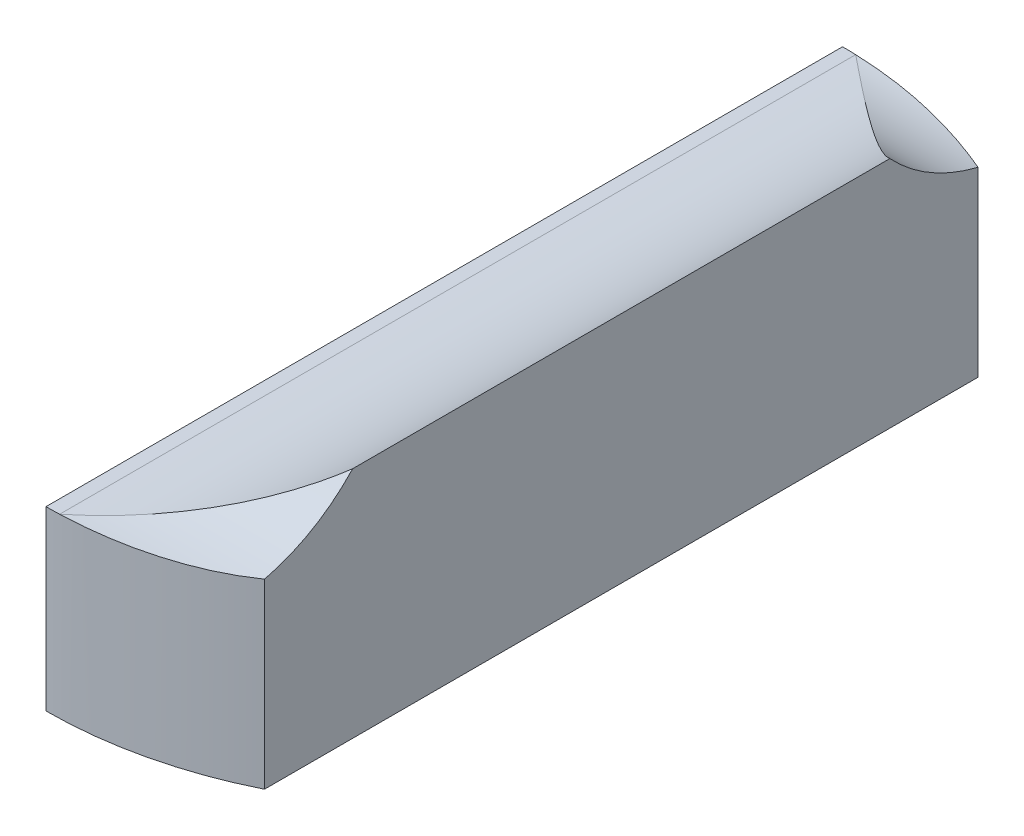
ISO-10303-21;
HEADER;
FILE_DESCRIPTION(('STEP AP214'),'2;1');
FILE_NAME('part.step','',(''),(''),'','','');
FILE_SCHEMA(('AUTOMOTIVE_DESIGN { 1 0 10303 214 1 1 1 1 }'));
ENDSEC;
DATA;
#1=APPLICATION_CONTEXT('core data for automotive mechanical design processes');
#2=APPLICATION_PROTOCOL_DEFINITION('international standard','automotive_design',2000,#1);
#3=PRODUCT_CONTEXT('',#1,'mechanical');
#4=PRODUCT('Part','Part','',(#3));
#5=PRODUCT_RELATED_PRODUCT_CATEGORY('part','',(#4));
#6=PRODUCT_DEFINITION_FORMATION('','',#4);
#7=PRODUCT_DEFINITION_CONTEXT('part definition',#1,'design');
#8=PRODUCT_DEFINITION('design','',#6,#7);
#9=PRODUCT_DEFINITION_SHAPE('','',#8);
#10=(LENGTH_UNIT() NAMED_UNIT(*) SI_UNIT(.MILLI.,.METRE.));
#11=(NAMED_UNIT(*) PLANE_ANGLE_UNIT() SI_UNIT($,.RADIAN.));
#12=(NAMED_UNIT(*) SI_UNIT($,.STERADIAN.) SOLID_ANGLE_UNIT());
#13=UNCERTAINTY_MEASURE_WITH_UNIT(LENGTH_MEASURE(1.E-05),#10,'distance_accuracy_value','');
#14=(GEOMETRIC_REPRESENTATION_CONTEXT(3) GLOBAL_UNCERTAINTY_ASSIGNED_CONTEXT((#13)) GLOBAL_UNIT_ASSIGNED_CONTEXT((#10,
#11,#12)) REPRESENTATION_CONTEXT('',''));
#15=CARTESIAN_POINT('',(0.,0.,0.));
#16=DIRECTION('',(0.,0.,1.));
#17=DIRECTION('',(1.,0.,0.));
#18=AXIS2_PLACEMENT_3D('',#15,#16,#17);
#19=CARTESIAN_POINT('',(0.,0.,0.));
#20=DIRECTION('',(0.,1.,0.));
#21=DIRECTION('',(1.,0.,0.));
#22=AXIS2_PLACEMENT_3D('',#19,#20,#21);
#23=CYLINDRICAL_SURFACE('',#22,28.575);
#24=DIRECTION('',(0.,1.,0.));
#25=VECTOR('',#24,1.);
#26=CARTESIAN_POINT('',(12.7,0.,-25.5976683508479));
#27=LINE('',#26,#25);
#28=CARTESIAN_POINT('',(12.7,0.,-25.5976683508479));
#29=VERTEX_POINT('',#28);
#30=CARTESIAN_POINT('',(12.7,13.0539279019213,-25.5976683508479));
#31=VERTEX_POINT('',#30);
#32=EDGE_CURVE('E346',#29,#31,#27,.T.);
#33=ORIENTED_EDGE('',*,*,#32,.F.);
#34=CARTESIAN_POINT('',(0.,0.,0.));
#35=DIRECTION('',(0.,1.,0.));
#36=DIRECTION('',(1.,0.,0.));
#37=AXIS2_PLACEMENT_3D('',#34,#35,#36);
#38=CIRCLE('',#37,28.575);
#39=CARTESIAN_POINT('',(0.,0.,-28.575));
#40=VERTEX_POINT('',#39);
#41=EDGE_CURVE('E332',#29,#40,#38,.T.);
#42=ORIENTED_EDGE('',*,*,#41,.T.);
#43=DIRECTION('',(0.,1.,0.));
#44=VECTOR('',#43,1.);
#45=CARTESIAN_POINT('',(0.,0.,-28.575));
#46=LINE('',#45,#44);
#47=CARTESIAN_POINT('',(0.,12.7,-28.575));
#48=VERTEX_POINT('',#47);
#49=EDGE_CURVE('E330',#48,#40,#46,.F.);
#50=ORIENTED_EDGE('',*,*,#49,.F.);
#51=CARTESIAN_POINT('',(0.,12.7,0.));
#52=DIRECTION('',(0.,1.,0.));
#53=DIRECTION('',(0.0333333333333333,0.,-0.999444290037663));
#54=AXIS2_PLACEMENT_3D('',#51,#52,#53);
#55=CIRCLE('',#54,28.575);
#56=CARTESIAN_POINT('',(0.962642841918007,12.7000054003817,-28.5587786987605));
#57=VERTEX_POINT('',#56);
#58=EDGE_CURVE('E163',#57,#48,#55,.T.);
#59=ORIENTED_EDGE('',*,*,#58,.F.);
#60=CARTESIAN_POINT('',(0.962642902416936,12.7000103571768,-28.5587804999168));
#61=CARTESIAN_POINT('',(1.36077615031565,12.7000623405133,-28.545365693838));
#62=CARTESIAN_POINT('',(1.75862825689667,12.7000777129765,-28.5236151588989));
#63=CARTESIAN_POINT('',(2.55307899624457,12.7004445435241,-28.4635033904875));
#64=CARTESIAN_POINT('',(2.94967761793325,12.7007960045706,-28.4251420106213));
#65=CARTESIAN_POINT('',(3.74118366922109,12.7022448100237,-28.3318388404815));
#66=CARTESIAN_POINT('',(4.13608981320989,12.7033426454376,-28.2768861487437));
#67=CARTESIAN_POINT('',(4.92324947448467,12.7069381444454,-28.1505085427578));
#68=CARTESIAN_POINT('',(5.31550300582789,12.7094358006152,-28.0790837158725));
#69=CARTESIAN_POINT('',(6.09971504117371,12.7166858056302,-27.9192672118512));
#70=CARTESIAN_POINT('',(6.49164726348036,12.7214556290705,-27.8307472529637));
#71=CARTESIAN_POINT('',(7.27137941731256,12.7342954372856,-27.6372759368325));
#72=CARTESIAN_POINT('',(7.65917937419231,12.7423654017998,-27.5323246804678));
#73=CARTESIAN_POINT('',(8.42975640726492,12.7630247664457,-27.3062442784199));
#74=CARTESIAN_POINT('',(8.812535403216,12.7756123837616,-27.1851215263703));
#75=CARTESIAN_POINT('',(9.57240196748498,12.8067151018847,-26.9269527073114));
#76=CARTESIAN_POINT('',(9.94948990980164,12.8252298113896,-26.7899076918588));
#77=CARTESIAN_POINT('',(10.8728927575956,12.8802289715004,-26.4321390525976));
#78=CARTESIAN_POINT('',(11.4154826552702,12.9210691871274,-26.2023507001268));
#79=CARTESIAN_POINT('',(12.4837500266805,13.0247001334094,-25.7105492113056));
#80=CARTESIAN_POINT('',(13.0094275044118,13.0874908588784,-25.4485360825686));
#81=CARTESIAN_POINT('',(14.0386470858148,13.2413188734462,-24.8955218171325));
#82=CARTESIAN_POINT('',(14.5422624206026,13.3322531031995,-24.6046290332762));
#83=CARTESIAN_POINT('',(15.5253033019172,13.5496409172664,-23.9964408297565));
#84=CARTESIAN_POINT('',(16.00473774698,13.6760813211813,-23.6791552381808));
#85=CARTESIAN_POINT('',(16.8002547898732,13.929279583978,-23.1180863962697));
#86=CARTESIAN_POINT('',(17.1234791710534,14.0453697562309,-22.8795842100204));
#87=CARTESIAN_POINT('',(17.7534814131775,14.3020869366,-22.3942506229836));
#88=CARTESIAN_POINT('',(18.0602635161153,14.4427075758031,-22.1474213975529));
#89=CARTESIAN_POINT('',(18.6552298763283,14.7509891906541,-21.6486405827816));
#90=CARTESIAN_POINT('',(18.9434257661075,14.918633018846,-21.3966923297231));
#91=CARTESIAN_POINT('',(19.4993082019271,15.2832535267728,-20.8913521403136));
#92=CARTESIAN_POINT('',(19.7669984548326,15.4802248858411,-20.637960473833));
#93=CARTESIAN_POINT('',(20.2341271799045,15.8672649269116,-20.1791498359493));
#94=CARTESIAN_POINT('',(20.4372307457066,16.0523162460672,-19.9732236603793));
#95=CARTESIAN_POINT('',(20.8271119032842,16.443796771241,-19.566332808773));
#96=CARTESIAN_POINT('',(21.0138928922247,16.6502215092449,-19.3653671066071));
#97=CARTESIAN_POINT('',(21.3701713388706,17.0844581862898,-18.9714767807781));
#98=CARTESIAN_POINT('',(21.5396731298472,17.3122647355465,-18.7785501482909));
#99=CARTESIAN_POINT('',(21.8606787693203,17.7888329761935,-18.4038644456906));
#100=CARTESIAN_POINT('',(22.0121823832151,18.0375949406601,-18.2221055211605));
#101=CARTESIAN_POINT('',(22.297438272533,18.5565357054162,-17.8719385766029));
#102=CARTESIAN_POINT('',(22.43108358143,18.8268293204708,-17.7036132443653));
#103=CARTESIAN_POINT('',(22.6792372793659,19.3860036069198,-17.3845820904179));
#104=CARTESIAN_POINT('',(22.7937450745925,19.6748848546794,-17.2338768154791));
#105=CARTESIAN_POINT('',(23.0034597025063,20.269136197845,-16.9529413254649));
#106=CARTESIAN_POINT('',(23.0986674148259,20.574505540976,-16.822710177309));
#107=CARTESIAN_POINT('',(23.2697906025738,21.1992400080802,-16.5852020755217));
#108=CARTESIAN_POINT('',(23.3457083796063,21.518603456992,-16.4779223836487));
#109=CARTESIAN_POINT('',(23.4701116509596,22.1280288861558,-16.3001450750981));
#110=CARTESIAN_POINT('',(23.5208356823792,22.4167889071979,-16.2267309964662));
#111=CARTESIAN_POINT('',(23.6076984467501,23.0008228741884,-16.1000964209253));
#112=CARTESIAN_POINT('',(23.6438389597366,23.2960960205151,-16.0468734595763));
#113=CARTESIAN_POINT('',(23.7016972571996,23.8916759999176,-15.9612926924391));
#114=CARTESIAN_POINT('',(23.7233869802776,24.1919914724441,-15.9289754861961));
#115=CARTESIAN_POINT('',(23.7450719580057,24.6440955559499,-15.8966136680499));
#116=CARTESIAN_POINT('',(23.7504920138014,24.795104240061,-15.8885120518663));
#117=CARTESIAN_POINT('',(23.7577175691597,25.0974022819727,-15.8777046291041));
#118=CARTESIAN_POINT('',(23.7595230358034,25.2486916423168,-15.874998871667));
#119=CARTESIAN_POINT('',(23.7595244060145,25.39999999873,-15.875));
#120=B_SPLINE_CURVE_WITH_KNOTS('',3,(#60,#61,#62,#63,#64,#65,#66,#67,#68,#69,#70,#71,#72,#73,
#74,#75,#76,#77,#78,#79,#80,#81,#82,#83,#84,#85,#86,#87,#88,#89,#90,#91,#92,#93,#94,#95,#96,#97,
#98,#99,#100,#101,#102,#103,#104,#105,#106,#107,#108,#109,#110,#111,#112,#113,#114,#115,#116,
#117,#118,#119),.UNSPECIFIED.,.F.,.F.,(4,2,2,2,2,2,2,2,2,2,2,2,2,2,2,2,2,2,2,2,2,2,2,2,2,2,2,2,
2,4),(0.,1.19499017100449,2.38999087385894,3.58577847732212,4.78155973885813,5.98668965465626,
7.19181217191521,8.3964596298037,9.60102757414392,11.3715014481902,13.1419749039502,
14.9060402358483,16.6694515852073,17.9228644913696,19.1759524534986,20.4282483813539,
21.6803173910788,22.7094151795703,23.738298272616,24.7669227046618,25.7955605430864,
26.8301070987827,27.8646857491597,28.8992172363417,29.9336252290081,30.8392539837282,
31.7447721657534,32.6520436509738,33.1058917453607,33.559743973042),.UNSPECIFIED.);
#121=EDGE_CURVE('E172',#57,#31,#120,.T.);
#122=ORIENTED_EDGE('',*,*,#121,.T.);
#123=EDGE_LOOP('',(#33,#42,#50,#59,#122));
#124=FACE_BOUND('',#123,.T.);
#125=ADVANCED_FACE('F49',(#124),#23,.T.);
#126=DIRECTION('',(0.,1.,0.));
#127=VECTOR('',#126,1.);
#128=CARTESIAN_POINT('',(12.7,0.,25.5976683508479));
#129=LINE('',#128,#127);
#130=CARTESIAN_POINT('',(12.7,13.0539279019213,25.5976683508479));
#131=VERTEX_POINT('',#130);
#132=CARTESIAN_POINT('',(12.7,0.,25.5976683508479));
#133=VERTEX_POINT('',#132);
#134=EDGE_CURVE('E349',#131,#133,#129,.F.);
#135=ORIENTED_EDGE('',*,*,#134,.F.);
#136=CARTESIAN_POINT('',(0.962642902407336,12.7000103571768,28.5587804999171));
#137=CARTESIAN_POINT('',(1.36077615030607,12.7000623405133,28.5453656938385));
#138=CARTESIAN_POINT('',(1.75862825688711,12.7000777129765,28.5236151588994));
#139=CARTESIAN_POINT('',(2.55307899623505,12.7004445435241,28.4635033904883));
#140=CARTESIAN_POINT('',(2.94967761792375,12.7007960045706,28.4251420106223));
#141=CARTESIAN_POINT('',(3.74118366921165,12.7022448100237,28.3318388404827));
#142=CARTESIAN_POINT('',(4.13608981320048,12.7033426454376,28.2768861487451));
#143=CARTESIAN_POINT('',(4.92324947447532,12.7069381444453,28.1505085427594));
#144=CARTESIAN_POINT('',(5.31550300581858,12.7094358006151,28.0790837158743));
#145=CARTESIAN_POINT('',(6.09971504116446,12.7166858056301,27.9192672118532));
#146=CARTESIAN_POINT('',(6.49164726347116,12.7214556290704,27.8307472529658));
#147=CARTESIAN_POINT('',(7.27137941730344,12.7342954372854,27.6372759368349));
#148=CARTESIAN_POINT('',(7.65917937418324,12.7423654017996,27.5323246804704));
#149=CARTESIAN_POINT('',(8.42975640725595,12.7630247664454,27.3062442784227));
#150=CARTESIAN_POINT('',(8.81253540320708,12.7756123837612,27.1851215263732));
#151=CARTESIAN_POINT('',(9.57240196747617,12.8067151018843,26.9269527073146));
#152=CARTESIAN_POINT('',(9.94948990979289,12.8252298113892,26.789907691862));
#153=CARTESIAN_POINT('',(10.8728927575873,12.8802289714998,26.4321390526011));
#154=CARTESIAN_POINT('',(11.4154826552622,12.9210691871268,26.2023507001303));
#155=CARTESIAN_POINT('',(12.4837500266732,13.0247001334086,25.7105492113091));
#156=CARTESIAN_POINT('',(13.0094275044049,13.0874908588775,25.4485360825722));
#157=CARTESIAN_POINT('',(14.0386470858086,13.2413188734451,24.895521817136));
#158=CARTESIAN_POINT('',(14.5422624205967,13.3322531031984,24.6046290332797));
#159=CARTESIAN_POINT('',(15.525303301912,13.5496409172651,23.9964408297599));
#160=CARTESIAN_POINT('',(16.0047377469751,13.6760813211799,23.6791552381842));
#161=CARTESIAN_POINT('',(16.8002547898687,13.9292795839765,23.1180863962729));
#162=CARTESIAN_POINT('',(17.1234791710491,14.0453697562292,22.8795842100236));
#163=CARTESIAN_POINT('',(17.7534814131735,14.3020869365982,22.3942506229869));
#164=CARTESIAN_POINT('',(18.0602635161113,14.4427075758013,22.1474213975561));
#165=CARTESIAN_POINT('',(18.6552298763247,14.750989190652,21.6486405827847));
#166=CARTESIAN_POINT('',(18.943425766104,14.9186330188439,21.3966923297261));
#167=CARTESIAN_POINT('',(19.499308201924,15.2832535267705,20.8913521403166));
#168=CARTESIAN_POINT('',(19.7669984548296,15.4802248858388,20.6379604738359));
#169=CARTESIAN_POINT('',(20.2341271799018,15.8672649269092,20.1791498359521));
#170=CARTESIAN_POINT('',(20.437230745704,16.0523162460648,19.973223660382));
#171=CARTESIAN_POINT('',(20.8271119032818,16.4437967712384,19.5663328087756));
#172=CARTESIAN_POINT('',(21.0138928922225,16.6502215092423,19.3653671066095));
#173=CARTESIAN_POINT('',(21.3701713388686,17.0844581862872,18.9714767807804));
#174=CARTESIAN_POINT('',(21.5396731298453,17.3122647355437,18.7785501482932));
#175=CARTESIAN_POINT('',(21.8606787693184,17.7888329761907,18.4038644456928));
#176=CARTESIAN_POINT('',(22.0121823832134,18.0375949406571,18.2221055211626));
#177=CARTESIAN_POINT('',(22.2974382725314,18.556535705413,17.8719385766049));
#178=CARTESIAN_POINT('',(22.4310835814285,18.8268293204675,17.7036132443673));
#179=CARTESIAN_POINT('',(22.6792372793645,19.3860036069163,17.3845820904198));
#180=CARTESIAN_POINT('',(22.7937450745911,19.6748848546757,17.233876815481));
#181=CARTESIAN_POINT('',(23.0034597025051,20.2691361978413,16.9529413254666));
#182=CARTESIAN_POINT('',(23.0986674148248,20.5745055409723,16.8227101773105));
#183=CARTESIAN_POINT('',(23.269790602573,21.1992400080767,16.5852020755229));
#184=CARTESIAN_POINT('',(23.3457083796055,21.5186034569886,16.4779223836498));
#185=CARTESIAN_POINT('',(23.4701116509792,22.1280288862518,16.3001450750701));
#186=CARTESIAN_POINT('',(23.520835682414,22.4167889073961,16.2267309964158));
#187=CARTESIAN_POINT('',(23.6076984468052,23.000822874595,16.1000964208445));
#188=CARTESIAN_POINT('',(23.6438389597967,23.2960960210277,16.0468734594876));
#189=CARTESIAN_POINT('',(23.7016972572599,23.8916760006455,15.9612926923495));
#190=CARTESIAN_POINT('',(23.723386980333,24.1919914732812,15.9289754861136));
#191=CARTESIAN_POINT('',(23.7450719580461,24.6440955569502,15.8966136679896));
#192=CARTESIAN_POINT('',(23.7504920138354,24.7951042411157,15.8885120518154));
#193=CARTESIAN_POINT('',(23.7577175691787,25.0974022831355,15.8777046290757));
#194=CARTESIAN_POINT('',(23.7595230358135,25.2486916435334,15.8749988716518));
#195=CARTESIAN_POINT('',(23.7595244060145,25.4,15.875));
#196=B_SPLINE_CURVE_WITH_KNOTS('',3,(#136,#137,#138,#139,#140,#141,#142,#143,#144,#145,#146,
#147,#148,#149,#150,#151,#152,#153,#154,#155,#156,#157,#158,#159,#160,#161,#162,#163,#164,#165,
#166,#167,#168,#169,#170,#171,#172,#173,#174,#175,#176,#177,#178,#179,#180,#181,#182,#183,#184,
#185,#186,#187,#188,#189,#190,#191,#192,#193,#194,#195),.UNSPECIFIED.,.F.,.F.,(4,2,2,2,2,2,2,2,
2,2,2,2,2,2,2,2,2,2,2,2,2,2,2,2,2,2,2,2,2,4),(0.,1.19499017100453,2.38999087385901,
3.58577847732223,4.78155973885826,5.98668965465643,7.19181217191541,8.39645962980394,
9.60102757414419,11.3715014481914,13.1419749039523,14.9060402358512,16.6694515852111,
17.9228644913736,19.1759524535028,20.4282483813585,21.6803173910837,22.7094151795755,
23.7382982726215,24.7669227046673,25.795560543092,26.8301070987882,27.8646857491649,
28.8992172363473,29.9336252290144,30.8392539840501,31.7447721663913,32.652043651932,
33.1058917464792,33.5597439743207),.UNSPECIFIED.);
#197=CARTESIAN_POINT('',(0.962642841908404,12.7000054003817,28.5587786987608));
#198=VERTEX_POINT('',#197);
#199=EDGE_CURVE('E115',#198,#131,#196,.T.);
#200=ORIENTED_EDGE('',*,*,#199,.F.);
#201=CARTESIAN_POINT('',(0.,12.7,0.));
#202=DIRECTION('',(0.,1.,0.));
#203=DIRECTION('',(0.,0.,1.));
#204=AXIS2_PLACEMENT_3D('',#201,#202,#203);
#205=CIRCLE('',#204,28.575);
#206=CARTESIAN_POINT('',(0.,12.7,28.575));
#207=VERTEX_POINT('',#206);
#208=EDGE_CURVE('E289',#207,#198,#205,.T.);
#209=ORIENTED_EDGE('',*,*,#208,.F.);
#210=DIRECTION('',(0.,1.,0.));
#211=VECTOR('',#210,1.);
#212=CARTESIAN_POINT('',(0.,0.,28.575));
#213=LINE('',#212,#211);
#214=CARTESIAN_POINT('',(0.,0.,28.575));
#215=VERTEX_POINT('',#214);
#216=EDGE_CURVE('E74',#215,#207,#213,.T.);
#217=ORIENTED_EDGE('',*,*,#216,.F.);
#218=EDGE_CURVE('E173',#215,#133,#38,.T.);
#219=ORIENTED_EDGE('',*,*,#218,.T.);
#220=EDGE_LOOP('',(#135,#200,#209,#217,#219));
#221=FACE_BOUND('',#220,.T.);
#222=ADVANCED_FACE('F201',(#221),#23,.T.);
#223=CARTESIAN_POINT('',(-31.75,25.4,-28.575));
#224=DIRECTION('',(-1.,0.,0.));
#225=DIRECTION('',(0.,0.,1.));
#226=AXIS2_PLACEMENT_3D('',#223,#224,#225);
#227=CYLINDRICAL_SURFACE('',#226,12.7);
#228=CARTESIAN_POINT('',(0.972785683817513,12.7000108007634,-28.558436809695));
#229=CARTESIAN_POINT('',(1.39477864676847,12.7004517464546,-28.2139796863513));
#230=CARTESIAN_POINT('',(1.81646994434711,12.7149237620887,-27.8691662452173));
#231=CARTESIAN_POINT('',(2.61755941400514,12.7692439852123,-27.214485255758));
#232=CARTESIAN_POINT('',(2.99704798471196,12.8064632610416,-26.9045081601199));
#233=CARTESIAN_POINT('',(3.71374587143984,12.8986075271286,-26.3204849810701));
#234=CARTESIAN_POINT('',(4.05106384697692,12.9511660989714,-26.0461982741114));
#235=CARTESIAN_POINT('',(4.68340138568608,13.0671014550362,-25.5336220195889));
#236=CARTESIAN_POINT('',(4.97855877267797,13.1283749884255,-25.2950248030805));
#237=CARTESIAN_POINT('',(5.58089147010995,13.2683799718961,-24.8092840821561));
#238=CARTESIAN_POINT('',(5.88799914395546,13.3477816142215,-24.5622486947605));
#239=CARTESIAN_POINT('',(6.47422976539284,13.5154466255225,-24.0911964232066));
#240=CARTESIAN_POINT('',(6.75355618431925,13.6024240313278,-23.8669736435613));
#241=CARTESIAN_POINT('',(7.38164812609229,13.8141264407907,-23.364449096259));
#242=CARTESIAN_POINT('',(7.72981617154926,13.942808360182,-23.0870538477609));
#243=CARTESIAN_POINT('',(8.40465877169154,14.2151054276523,-22.5522478075338));
#244=CARTESIAN_POINT('',(8.73153082794255,14.3576382681183,-22.2945352304148));
#245=CARTESIAN_POINT('',(9.36379378683177,14.65483943855,-21.7992739808317));
#246=CARTESIAN_POINT('',(9.6694048935974,14.8084639782142,-21.5613805976691));
#247=CARTESIAN_POINT('',(10.2591348977441,15.1252314624498,-21.1056091222698));
#248=CARTESIAN_POINT('',(10.5435020674997,15.2873661544862,-20.8873545960458));
#249=CARTESIAN_POINT('',(10.9539062598845,15.535888997538,-20.5746901197505));
#250=CARTESIAN_POINT('',(11.0819404782833,15.615515153932,-20.4774829903615));
#251=CARTESIAN_POINT('',(11.386972376969,15.8103823967986,-20.2467257586035));
#252=CARTESIAN_POINT('',(11.5634403225821,15.9273232137782,-20.1139045651206));
#253=CARTESIAN_POINT('',(12.0632595515677,16.270881819338,-19.7399637752601));
#254=CARTESIAN_POINT('',(12.383755321167,16.5061140447183,-19.5029136618797));
#255=CARTESIAN_POINT('',(12.699691218957,16.7537714883731,-19.2727028361415));
#256=B_SPLINE_CURVE_WITH_KNOTS('',3,(#228,#229,#230,#231,#232,#233,#234,#235,#236,#237,#238,
#239,#240,#241,#242,#243,#244,#245,#246,#247,#248,#249,#250,#251,#252,#253,#254,#255),
.UNSPECIFIED.,.F.,.F.,(4,2,2,2,2,2,2,2,2,2,2,2,2,4),(0.,1.63399979520736,3.10768948926802,
4.4210728279512,5.57415968056014,6.77997514659733,7.88551974536436,9.27510124204999,
10.594508450295,11.843975715055,13.0237792349269,13.5619264941138,14.3115408173584,
15.6993453326125),.UNSPECIFIED.);
#257=CARTESIAN_POINT('',(12.6999999387665,16.753534986885,-19.2733269453938));
#258=VERTEX_POINT('',#257);
#259=EDGE_CURVE('E124',#57,#258,#256,.T.);
#260=ORIENTED_EDGE('',*,*,#259,.T.);
#261=CARTESIAN_POINT('',(12.7,25.4,-28.575));
#262=DIRECTION('',(-1.,0.,0.));
#263=DIRECTION('',(0.,0.,1.));
#264=AXIS2_PLACEMENT_3D('',#261,#262,#263);
#265=CIRCLE('',#264,12.7);
#266=EDGE_CURVE('E67',#258,#31,#265,.F.);
#267=ORIENTED_EDGE('',*,*,#266,.T.);
#268=ORIENTED_EDGE('',*,*,#121,.F.);
#269=EDGE_LOOP('',(#260,#267,#268));
#270=FACE_BOUND('',#269,.T.);
#271=ADVANCED_FACE('F51',(#270),#227,.F.);
#272=CARTESIAN_POINT('',(-31.75,25.4,28.575));
#273=DIRECTION('',(1.,0.,0.));
#274=DIRECTION('',(0.,0.,-1.));
#275=AXIS2_PLACEMENT_3D('',#272,#273,#274);
#276=CYLINDRICAL_SURFACE('',#275,12.7);
#277=ORIENTED_EDGE('',*,*,#199,.T.);
#278=CARTESIAN_POINT('',(12.7,25.4,28.575));
#279=DIRECTION('',(-1.,0.,0.));
#280=DIRECTION('',(0.,0.,1.));
#281=AXIS2_PLACEMENT_3D('',#278,#279,#280);
#282=CIRCLE('',#281,12.7);
#283=CARTESIAN_POINT('',(12.6999999346512,16.7535350695487,19.2733433640383));
#284=VERTEX_POINT('',#283);
#285=EDGE_CURVE('E103',#131,#284,#282,.F.);
#286=ORIENTED_EDGE('',*,*,#285,.T.);
#287=CARTESIAN_POINT('',(0.972785683816597,12.7000108007634,28.5584368096954));
#288=CARTESIAN_POINT('',(1.3959465149126,12.7004591889127,28.2128758211915));
#289=CARTESIAN_POINT('',(1.81945547422739,12.7150120031262,27.8677555773898));
#290=CARTESIAN_POINT('',(2.62369446534101,12.7696020071415,27.2131368498875));
#291=CARTESIAN_POINT('',(3.00449764341585,12.8069659278282,26.9035032206444));
#292=CARTESIAN_POINT('',(3.7225269157729,12.8993857028764,26.3198378950587));
#293=CARTESIAN_POINT('',(4.0599304955111,12.952038015754,26.0456432469733));
#294=CARTESIAN_POINT('',(4.69112776519681,13.0680569921309,25.5328794726822));
#295=CARTESIAN_POINT('',(4.9851475127734,13.1292892647449,25.294103668732));
#296=CARTESIAN_POINT('',(5.5843783813939,13.2690104124975,24.8083841343664));
#297=CARTESIAN_POINT('',(5.88952043205384,13.3481336982755,24.5615365163666));
#298=CARTESIAN_POINT('',(6.47377339804263,13.5153441003377,24.0913422492119));
#299=CARTESIAN_POINT('',(6.75300299967373,13.6021974315979,23.8677030008421));
#300=CARTESIAN_POINT('',(7.38131535678754,13.8137398890529,23.3660277673098));
#301=CARTESIAN_POINT('',(7.72978345066991,13.9424046028986,23.088884945812));
#302=CARTESIAN_POINT('',(8.40496467175149,14.2146380824337,22.5544682044837));
#303=CARTESIAN_POINT('',(8.73188385735606,14.357118047457,22.296900042946));
#304=CARTESIAN_POINT('',(9.3638744538956,14.654192387615,21.8016135368892));
#305=CARTESIAN_POINT('',(9.66918240112445,14.8077379585752,21.5635684571905));
#306=CARTESIAN_POINT('',(10.258142487981,15.1243283080482,21.1073545304415));
#307=CARTESIAN_POINT('',(10.5420511289461,15.2863622181916,20.88881846328));
#308=CARTESIAN_POINT('',(10.9526425547042,15.5351174643917,20.5754602272357));
#309=CARTESIAN_POINT('',(11.0812142276617,15.6151082232846,20.4777270576622));
#310=CARTESIAN_POINT('',(11.3863631252633,15.8100760326946,20.2468000375732));
#311=CARTESIAN_POINT('',(11.5624587751776,15.9267150841252,20.1143670990856));
#312=CARTESIAN_POINT('',(12.062561895599,16.2701882476759,19.7407269806735));
#313=CARTESIAN_POINT('',(12.3837902844569,16.5056738422132,19.5037239117813));
#314=CARTESIAN_POINT('',(12.7003125989401,16.7536204655862,19.2734043980917));
#315=B_SPLINE_CURVE_WITH_KNOTS('',3,(#287,#288,#289,#290,#291,#292,#293,#294,#295,#296,#297,
#298,#299,#300,#301,#302,#303,#304,#305,#306,#307,#308,#309,#310,#311,#312,#313,#314),
.UNSPECIFIED.,.F.,.F.,(4,2,2,2,2,2,2,2,2,2,2,2,2,4),(0.,1.63880518900772,3.11492480279298,
4.42836798216972,5.57915260896583,6.779959252684,7.88413095335502,9.27392284901213,
10.5931313242071,11.842106403945,13.0212608759869,13.5618986302937,14.3096825529086,
15.6993177492004),.UNSPECIFIED.);
#316=EDGE_CURVE('E112',#198,#284,#315,.T.);
#317=ORIENTED_EDGE('',*,*,#316,.F.);
#318=EDGE_LOOP('',(#277,#286,#317));
#319=FACE_BOUND('',#318,.T.);
#320=ADVANCED_FACE('F111',(#319),#276,.F.);
#321=CARTESIAN_POINT('',(0.,0.,0.));
#322=DIRECTION('',(0.,1.,0.));
#323=DIRECTION('',(1.,0.,0.));
#324=AXIS2_PLACEMENT_3D('',#321,#322,#323);
#325=PLANE('',#324);
#326=ORIENTED_EDGE('',*,*,#41,.F.);
#327=DIRECTION('',(0.,0.,1.));
#328=VECTOR('',#327,1.);
#329=CARTESIAN_POINT('',(12.7,0.,0.));
#330=LINE('',#329,#328);
#331=EDGE_CURVE('E340',#29,#133,#330,.T.);
#332=ORIENTED_EDGE('',*,*,#331,.T.);
#333=ORIENTED_EDGE('',*,*,#218,.F.);
#334=DIRECTION('',(0.,0.,-1.));
#335=VECTOR('',#334,1.);
#336=CARTESIAN_POINT('',(0.,0.,0.));
#337=LINE('',#336,#335);
#338=EDGE_CURVE('E335',#215,#40,#337,.T.);
#339=ORIENTED_EDGE('',*,*,#338,.T.);
#340=EDGE_LOOP('',(#326,#332,#333,#339));
#341=FACE_BOUND('',#340,.T.);
#342=ADVANCED_FACE('F144',(#341),#325,.F.);
#343=CARTESIAN_POINT('',(0.9525,31.75,103.07574));
#344=DIRECTION('',(0.,0.,-1.));
#345=DIRECTION('',(1.,0.,0.));
#346=AXIS2_PLACEMENT_3D('',#343,#344,#345);
#347=CYLINDRICAL_SURFACE('',#346,19.05);
#348=ORIENTED_EDGE('',*,*,#316,.T.);
#349=DIRECTION('',(0.,0.,-1.));
#350=VECTOR('',#349,1.);
#351=CARTESIAN_POINT('',(12.7,16.7533755881532,103.07574));
#352=LINE('',#351,#350);
#353=EDGE_CURVE('E13',#284,#258,#352,.T.);
#354=ORIENTED_EDGE('',*,*,#353,.T.);
#355=ORIENTED_EDGE('',*,*,#259,.F.);
#356=DIRECTION('',(0.,0.,1.));
#357=VECTOR('',#356,1.);
#358=CARTESIAN_POINT('',(0.952500000000002,12.7,-31.75));
#359=LINE('',#358,#357);
#360=EDGE_CURVE('E122',#198,#57,#359,.F.);
#361=ORIENTED_EDGE('',*,*,#360,.F.);
#362=EDGE_LOOP('',(#348,#354,#355,#361));
#363=FACE_BOUND('',#362,.T.);
#364=ADVANCED_FACE('F120',(#363),#347,.F.);
#365=CARTESIAN_POINT('',(-20.0025,12.7,-31.75));
#366=DIRECTION('',(0.,-1.,0.));
#367=DIRECTION('',(1.,0.,0.));
#368=AXIS2_PLACEMENT_3D('',#365,#366,#367);
#369=PLANE('',#368);
#370=ORIENTED_EDGE('',*,*,#58,.T.);
#371=DIRECTION('',(0.,0.,1.));
#372=VECTOR('',#371,1.);
#373=CARTESIAN_POINT('',(0.,12.7,-31.75));
#374=LINE('',#373,#372);
#375=EDGE_CURVE('E60',#48,#207,#374,.T.);
#376=ORIENTED_EDGE('',*,*,#375,.T.);
#377=ORIENTED_EDGE('',*,*,#208,.T.);
#378=ORIENTED_EDGE('',*,*,#360,.T.);
#379=EDGE_LOOP('',(#370,#376,#377,#378));
#380=FACE_BOUND('',#379,.T.);
#381=ADVANCED_FACE('F143',(#380),#369,.F.);
#382=CARTESIAN_POINT('',(0.,0.,0.));
#383=DIRECTION('',(1.,0.,0.));
#384=DIRECTION('',(0.,0.,-1.));
#385=AXIS2_PLACEMENT_3D('',#382,#383,#384);
#386=PLANE('',#385);
#387=ORIENTED_EDGE('',*,*,#216,.T.);
#388=ORIENTED_EDGE('',*,*,#375,.F.);
#389=ORIENTED_EDGE('',*,*,#49,.T.);
#390=ORIENTED_EDGE('',*,*,#338,.F.);
#391=EDGE_LOOP('',(#387,#388,#389,#390));
#392=FACE_BOUND('',#391,.T.);
#393=ADVANCED_FACE('F145',(#392),#386,.F.);
#394=CARTESIAN_POINT('',(12.7,0.,0.));
#395=DIRECTION('',(-1.,0.,0.));
#396=DIRECTION('',(0.,0.,1.));
#397=AXIS2_PLACEMENT_3D('',#394,#395,#396);
#398=PLANE('',#397);
#399=ORIENTED_EDGE('',*,*,#32,.T.);
#400=ORIENTED_EDGE('',*,*,#266,.F.);
#401=ORIENTED_EDGE('',*,*,#353,.F.);
#402=ORIENTED_EDGE('',*,*,#285,.F.);
#403=ORIENTED_EDGE('',*,*,#134,.T.);
#404=ORIENTED_EDGE('',*,*,#331,.F.);
#405=EDGE_LOOP('',(#399,#400,#401,#402,#403,#404));
#406=FACE_BOUND('',#405,.T.);
#407=ADVANCED_FACE('F102',(#406),#398,.F.);
#408=CLOSED_SHELL('',(#125,#222,#271,#320,#342,#364,#381,#393,#407));
#409=MANIFOLD_SOLID_BREP('B2',#408);
#410=ADVANCED_BREP_SHAPE_REPRESENTATION('',(#18,#409),#14);
#411=SHAPE_DEFINITION_REPRESENTATION(#9,#410);
ENDSEC;
END-ISO-10303-21;
